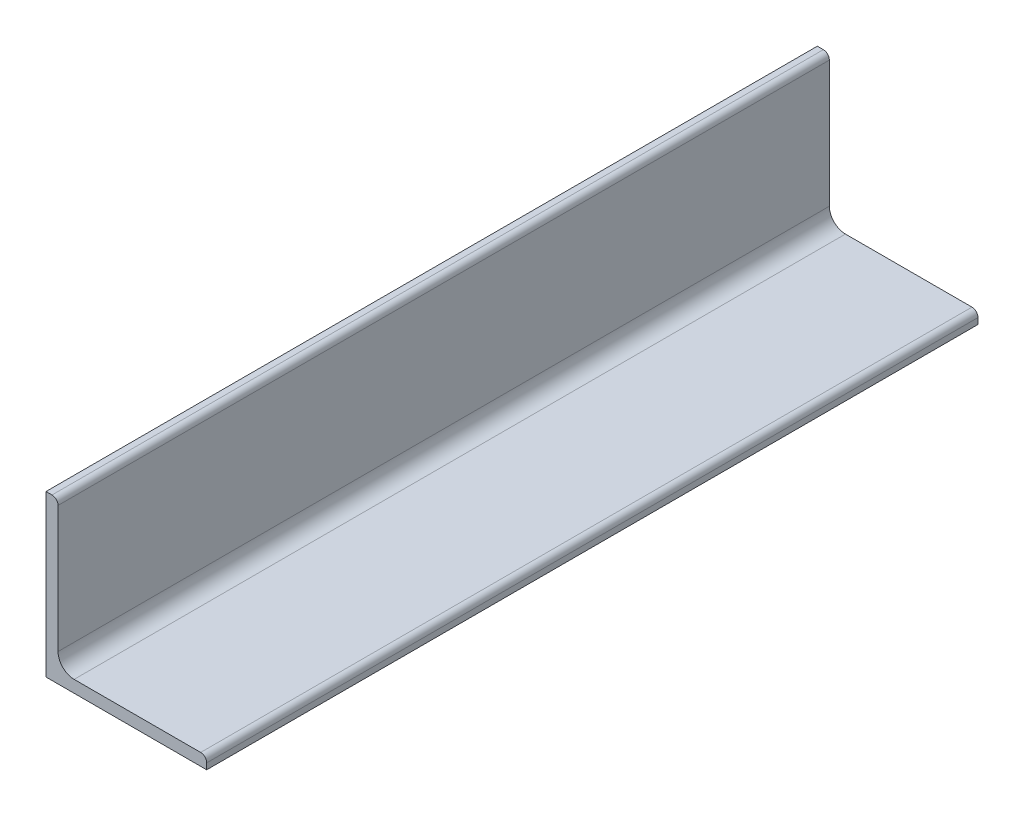
ISO-10303-21;
HEADER;
FILE_DESCRIPTION(('STEP AP214'),'2;1');
FILE_NAME('part.step','',(''),(''),'','','');
FILE_SCHEMA(('AUTOMOTIVE_DESIGN { 1 0 10303 214 1 1 1 1 }'));
ENDSEC;
DATA;
#1=APPLICATION_CONTEXT('core data for automotive mechanical design processes');
#2=APPLICATION_PROTOCOL_DEFINITION('international standard','automotive_design',2000,#1);
#3=PRODUCT_CONTEXT('',#1,'mechanical');
#4=PRODUCT('Part','Part','',(#3));
#5=PRODUCT_RELATED_PRODUCT_CATEGORY('part','',(#4));
#6=PRODUCT_DEFINITION_FORMATION('','',#4);
#7=PRODUCT_DEFINITION_CONTEXT('part definition',#1,'design');
#8=PRODUCT_DEFINITION('design','',#6,#7);
#9=PRODUCT_DEFINITION_SHAPE('','',#8);
#10=(LENGTH_UNIT() NAMED_UNIT(*) SI_UNIT(.MILLI.,.METRE.));
#11=(NAMED_UNIT(*) PLANE_ANGLE_UNIT() SI_UNIT($,.RADIAN.));
#12=(NAMED_UNIT(*) SI_UNIT($,.STERADIAN.) SOLID_ANGLE_UNIT());
#13=UNCERTAINTY_MEASURE_WITH_UNIT(LENGTH_MEASURE(1.E-05),#10,'distance_accuracy_value','');
#14=(GEOMETRIC_REPRESENTATION_CONTEXT(3) GLOBAL_UNCERTAINTY_ASSIGNED_CONTEXT((#13)) GLOBAL_UNIT_ASSIGNED_CONTEXT((#10,
#11,#12)) REPRESENTATION_CONTEXT('',''));
#15=CARTESIAN_POINT('',(0.,0.,0.));
#16=DIRECTION('',(0.,0.,1.));
#17=DIRECTION('',(1.,0.,0.));
#18=AXIS2_PLACEMENT_3D('',#15,#16,#17);
#19=CARTESIAN_POINT('',(0.897927251325018,63.8534276781816,304.8));
#20=DIRECTION('',(1.,0.,0.));
#21=DIRECTION('',(0.,0.,-1.));
#22=AXIS2_PLACEMENT_3D('',#19,#20,#21);
#23=PLANE('',#22);
#24=DIRECTION('',(0.,-1.,0.));
#25=VECTOR('',#24,1.);
#26=CARTESIAN_POINT('',(0.897927251325018,63.8534276781816,0.));
#27=LINE('',#26,#25);
#28=CARTESIAN_POINT('',(0.897927251325018,63.8534276781816,0.));
#29=VERTEX_POINT('',#28);
#30=CARTESIAN_POINT('',(0.897927251325018,0.353427678181561,0.));
#31=VERTEX_POINT('',#30);
#32=EDGE_CURVE('E135',#29,#31,#27,.T.);
#33=ORIENTED_EDGE('',*,*,#32,.T.);
#34=DIRECTION('',(0.,0.,-1.));
#35=VECTOR('',#34,1.);
#36=CARTESIAN_POINT('',(0.897927251325018,0.353427678181561,304.8));
#37=LINE('',#36,#35);
#38=CARTESIAN_POINT('',(0.897927251325018,0.353427678181561,304.8));
#39=VERTEX_POINT('',#38);
#40=EDGE_CURVE('E11',#39,#31,#37,.T.);
#41=ORIENTED_EDGE('',*,*,#40,.F.);
#42=DIRECTION('',(0.,-1.,0.));
#43=VECTOR('',#42,1.);
#44=CARTESIAN_POINT('',(0.897927251325018,63.8534276781816,304.8));
#45=LINE('',#44,#43);
#46=CARTESIAN_POINT('',(0.897927251325018,63.8534276781816,304.8));
#47=VERTEX_POINT('',#46);
#48=EDGE_CURVE('E151',#47,#39,#45,.T.);
#49=ORIENTED_EDGE('',*,*,#48,.F.);
#50=DIRECTION('',(0.,0.,-1.));
#51=VECTOR('',#50,1.);
#52=CARTESIAN_POINT('',(0.897927251325018,63.8534276781816,304.8));
#53=LINE('',#52,#51);
#54=EDGE_CURVE('E131',#47,#29,#53,.T.);
#55=ORIENTED_EDGE('',*,*,#54,.T.);
#56=EDGE_LOOP('',(#33,#41,#49,#55));
#57=FACE_BOUND('',#56,.T.);
#58=ADVANCED_FACE('F33',(#57),#23,.F.);
#59=CARTESIAN_POINT('',(0.897927251325018,0.353427678181561,304.8));
#60=DIRECTION('',(0.,1.,0.));
#61=DIRECTION('',(0.,0.,1.));
#62=AXIS2_PLACEMENT_3D('',#59,#60,#61);
#63=PLANE('',#62);
#64=DIRECTION('',(1.,0.,0.));
#65=VECTOR('',#64,1.);
#66=CARTESIAN_POINT('',(0.897927251325018,0.353427678181561,0.));
#67=LINE('',#66,#65);
#68=CARTESIAN_POINT('',(64.397927251325,0.353427678181561,0.));
#69=VERTEX_POINT('',#68);
#70=EDGE_CURVE('E138',#31,#69,#67,.T.);
#71=ORIENTED_EDGE('',*,*,#70,.T.);
#72=DIRECTION('',(0.,0.,-1.));
#73=VECTOR('',#72,1.);
#74=CARTESIAN_POINT('',(64.397927251325,0.353427678181561,304.8));
#75=LINE('',#74,#73);
#76=CARTESIAN_POINT('',(64.397927251325,0.353427678181561,304.8));
#77=VERTEX_POINT('',#76);
#78=EDGE_CURVE('E41',#77,#69,#75,.T.);
#79=ORIENTED_EDGE('',*,*,#78,.F.);
#80=DIRECTION('',(1.,0.,0.));
#81=VECTOR('',#80,1.);
#82=CARTESIAN_POINT('',(0.897927251325018,0.353427678181561,304.8));
#83=LINE('',#82,#81);
#84=EDGE_CURVE('E95',#39,#77,#83,.T.);
#85=ORIENTED_EDGE('',*,*,#84,.F.);
#86=ORIENTED_EDGE('',*,*,#40,.T.);
#87=EDGE_LOOP('',(#71,#79,#85,#86));
#88=FACE_BOUND('',#87,.T.);
#89=ADVANCED_FACE('F194',(#88),#63,.F.);
#90=CARTESIAN_POINT('',(64.397927251325,0.353427678181561,304.8));
#91=DIRECTION('',(-1.,0.,0.));
#92=DIRECTION('',(0.,0.,1.));
#93=AXIS2_PLACEMENT_3D('',#90,#91,#92);
#94=PLANE('',#93);
#95=DIRECTION('',(0.,1.,0.));
#96=VECTOR('',#95,1.);
#97=CARTESIAN_POINT('',(64.397927251325,0.353427678181561,0.));
#98=LINE('',#97,#96);
#99=CARTESIAN_POINT('',(64.397927251325,2.73467767818156,0.));
#100=VERTEX_POINT('',#99);
#101=EDGE_CURVE('E140',#69,#100,#98,.T.);
#102=ORIENTED_EDGE('',*,*,#101,.T.);
#103=DIRECTION('',(0.,0.,-1.));
#104=VECTOR('',#103,1.);
#105=CARTESIAN_POINT('',(64.397927251325,2.73467767818156,304.8));
#106=LINE('',#105,#104);
#107=CARTESIAN_POINT('',(64.397927251325,2.73467767818156,304.8));
#108=VERTEX_POINT('',#107);
#109=EDGE_CURVE('E161',#108,#100,#106,.T.);
#110=ORIENTED_EDGE('',*,*,#109,.F.);
#111=DIRECTION('',(0.,1.,0.));
#112=VECTOR('',#111,1.);
#113=CARTESIAN_POINT('',(64.397927251325,0.353427678181561,304.8));
#114=LINE('',#113,#112);
#115=EDGE_CURVE('E169',#77,#108,#114,.T.);
#116=ORIENTED_EDGE('',*,*,#115,.F.);
#117=ORIENTED_EDGE('',*,*,#78,.T.);
#118=EDGE_LOOP('',(#102,#110,#116,#117));
#119=FACE_BOUND('',#118,.T.);
#120=ADVANCED_FACE('F167',(#119),#94,.F.);
#121=CARTESIAN_POINT('',(62.016677251325,2.73467767818156,304.8));
#122=DIRECTION('',(0.,0.,-1.));
#123=DIRECTION('',(-1.,0.,0.));
#124=AXIS2_PLACEMENT_3D('',#121,#122,#123);
#125=CYLINDRICAL_SURFACE('',#124,2.38125);
#126=CARTESIAN_POINT('',(62.016677251325,2.73467767818156,0.));
#127=DIRECTION('',(0.,0.,1.));
#128=DIRECTION('',(1.,0.,0.));
#129=AXIS2_PLACEMENT_3D('',#126,#127,#128);
#130=CIRCLE('',#129,2.38125);
#131=CARTESIAN_POINT('',(62.016677251325,5.11592767818156,0.));
#132=VERTEX_POINT('',#131);
#133=EDGE_CURVE('E142',#100,#132,#130,.T.);
#134=ORIENTED_EDGE('',*,*,#133,.T.);
#135=DIRECTION('',(0.,0.,-1.));
#136=VECTOR('',#135,1.);
#137=CARTESIAN_POINT('',(62.016677251325,5.11592767818156,304.8));
#138=LINE('',#137,#136);
#139=CARTESIAN_POINT('',(62.016677251325,5.11592767818156,304.8));
#140=VERTEX_POINT('',#139);
#141=EDGE_CURVE('E158',#140,#132,#138,.T.);
#142=ORIENTED_EDGE('',*,*,#141,.F.);
#143=CARTESIAN_POINT('',(62.016677251325,2.73467767818156,304.8));
#144=DIRECTION('',(0.,0.,1.));
#145=DIRECTION('',(1.,0.,0.));
#146=AXIS2_PLACEMENT_3D('',#143,#144,#145);
#147=CIRCLE('',#146,2.38125);
#148=EDGE_CURVE('E185',#108,#140,#147,.T.);
#149=ORIENTED_EDGE('',*,*,#148,.F.);
#150=ORIENTED_EDGE('',*,*,#109,.T.);
#151=EDGE_LOOP('',(#134,#142,#149,#150));
#152=FACE_BOUND('',#151,.T.);
#153=ADVANCED_FACE('F178',(#152),#125,.T.);
#154=CARTESIAN_POINT('',(62.016677251325,5.11592767818156,304.8));
#155=DIRECTION('',(0.,-1.,0.));
#156=DIRECTION('',(0.,0.,-1.));
#157=AXIS2_PLACEMENT_3D('',#154,#155,#156);
#158=PLANE('',#157);
#159=DIRECTION('',(-1.,0.,0.));
#160=VECTOR('',#159,1.);
#161=CARTESIAN_POINT('',(62.016677251325,5.11592767818156,0.));
#162=LINE('',#161,#160);
#163=CARTESIAN_POINT('',(12.010427251325,5.11592767818156,0.));
#164=VERTEX_POINT('',#163);
#165=EDGE_CURVE('E144',#132,#164,#162,.T.);
#166=ORIENTED_EDGE('',*,*,#165,.T.);
#167=DIRECTION('',(0.,0.,-1.));
#168=VECTOR('',#167,1.);
#169=CARTESIAN_POINT('',(12.010427251325,5.11592767818156,304.8));
#170=LINE('',#169,#168);
#171=CARTESIAN_POINT('',(12.010427251325,5.11592767818156,304.8));
#172=VERTEX_POINT('',#171);
#173=EDGE_CURVE('E155',#172,#164,#170,.T.);
#174=ORIENTED_EDGE('',*,*,#173,.F.);
#175=DIRECTION('',(-1.,0.,0.));
#176=VECTOR('',#175,1.);
#177=CARTESIAN_POINT('',(62.016677251325,5.11592767818156,304.8));
#178=LINE('',#177,#176);
#179=EDGE_CURVE('E184',#140,#172,#178,.T.);
#180=ORIENTED_EDGE('',*,*,#179,.F.);
#181=ORIENTED_EDGE('',*,*,#141,.T.);
#182=EDGE_LOOP('',(#166,#174,#180,#181));
#183=FACE_BOUND('',#182,.T.);
#184=ADVANCED_FACE('F182',(#183),#158,.F.);
#185=CARTESIAN_POINT('',(12.010427251325,11.4659276781816,304.8));
#186=DIRECTION('',(0.,0.,-1.));
#187=DIRECTION('',(-1.,0.,0.));
#188=AXIS2_PLACEMENT_3D('',#185,#186,#187);
#189=CYLINDRICAL_SURFACE('',#188,6.34999999999999);
#190=CARTESIAN_POINT('',(12.010427251325,11.4659276781816,0.));
#191=DIRECTION('',(0.,0.,-1.));
#192=DIRECTION('',(1.,0.,0.));
#193=AXIS2_PLACEMENT_3D('',#190,#191,#192);
#194=CIRCLE('',#193,6.34999999999999);
#195=CARTESIAN_POINT('',(5.66042725132502,11.4659276781816,0.));
#196=VERTEX_POINT('',#195);
#197=EDGE_CURVE('E146',#164,#196,#194,.T.);
#198=ORIENTED_EDGE('',*,*,#197,.T.);
#199=DIRECTION('',(0.,0.,-1.));
#200=VECTOR('',#199,1.);
#201=CARTESIAN_POINT('',(5.66042725132502,11.4659276781816,304.8));
#202=LINE('',#201,#200);
#203=CARTESIAN_POINT('',(5.66042725132502,11.4659276781816,304.8));
#204=VERTEX_POINT('',#203);
#205=EDGE_CURVE('E126',#204,#196,#202,.T.);
#206=ORIENTED_EDGE('',*,*,#205,.F.);
#207=CARTESIAN_POINT('',(12.010427251325,11.4659276781816,304.8));
#208=DIRECTION('',(0.,0.,-1.));
#209=DIRECTION('',(1.,0.,0.));
#210=AXIS2_PLACEMENT_3D('',#207,#208,#209);
#211=CIRCLE('',#210,6.34999999999999);
#212=EDGE_CURVE('E117',#172,#204,#211,.T.);
#213=ORIENTED_EDGE('',*,*,#212,.F.);
#214=ORIENTED_EDGE('',*,*,#173,.T.);
#215=EDGE_LOOP('',(#198,#206,#213,#214));
#216=FACE_BOUND('',#215,.T.);
#217=ADVANCED_FACE('F206',(#216),#189,.F.);
#218=CARTESIAN_POINT('',(5.66042725132502,11.4659276781816,304.8));
#219=DIRECTION('',(-1.,0.,0.));
#220=DIRECTION('',(0.,0.,1.));
#221=AXIS2_PLACEMENT_3D('',#218,#219,#220);
#222=PLANE('',#221);
#223=DIRECTION('',(0.,1.,0.));
#224=VECTOR('',#223,1.);
#225=CARTESIAN_POINT('',(5.66042725132502,11.4659276781816,0.));
#226=LINE('',#225,#224);
#227=CARTESIAN_POINT('',(5.66042725132502,61.4721776781816,0.));
#228=VERTEX_POINT('',#227);
#229=EDGE_CURVE('E125',#196,#228,#226,.T.);
#230=ORIENTED_EDGE('',*,*,#229,.T.);
#231=DIRECTION('',(0.,0.,-1.));
#232=VECTOR('',#231,1.);
#233=CARTESIAN_POINT('',(5.66042725132502,61.4721776781816,304.8));
#234=LINE('',#233,#232);
#235=CARTESIAN_POINT('',(5.66042725132502,61.4721776781816,304.8));
#236=VERTEX_POINT('',#235);
#237=EDGE_CURVE('E122',#236,#228,#234,.T.);
#238=ORIENTED_EDGE('',*,*,#237,.F.);
#239=DIRECTION('',(0.,1.,0.));
#240=VECTOR('',#239,1.);
#241=CARTESIAN_POINT('',(5.66042725132502,11.4659276781816,304.8));
#242=LINE('',#241,#240);
#243=EDGE_CURVE('E111',#204,#236,#242,.T.);
#244=ORIENTED_EDGE('',*,*,#243,.F.);
#245=ORIENTED_EDGE('',*,*,#205,.T.);
#246=EDGE_LOOP('',(#230,#238,#244,#245));
#247=FACE_BOUND('',#246,.T.);
#248=ADVANCED_FACE('F123',(#247),#222,.F.);
#249=CARTESIAN_POINT('',(3.27917725132502,61.4721776781816,304.8));
#250=DIRECTION('',(0.,0.,-1.));
#251=DIRECTION('',(-1.,0.,0.));
#252=AXIS2_PLACEMENT_3D('',#249,#250,#251);
#253=CYLINDRICAL_SURFACE('',#252,2.38125);
#254=CARTESIAN_POINT('',(3.27917725132502,61.4721776781816,0.));
#255=DIRECTION('',(0.,0.,1.));
#256=DIRECTION('',(1.,0.,0.));
#257=AXIS2_PLACEMENT_3D('',#254,#255,#256);
#258=CIRCLE('',#257,2.38125);
#259=CARTESIAN_POINT('',(3.27917725132502,63.8534276781816,0.));
#260=VERTEX_POINT('',#259);
#261=EDGE_CURVE('E81',#228,#260,#258,.T.);
#262=ORIENTED_EDGE('',*,*,#261,.T.);
#263=DIRECTION('',(0.,0.,-1.));
#264=VECTOR('',#263,1.);
#265=CARTESIAN_POINT('',(3.27917725132502,63.8534276781816,304.8));
#266=LINE('',#265,#264);
#267=CARTESIAN_POINT('',(3.27917725132502,63.8534276781816,304.8));
#268=VERTEX_POINT('',#267);
#269=EDGE_CURVE('E127',#268,#260,#266,.T.);
#270=ORIENTED_EDGE('',*,*,#269,.F.);
#271=CARTESIAN_POINT('',(3.27917725132502,61.4721776781816,304.8));
#272=DIRECTION('',(0.,0.,1.));
#273=DIRECTION('',(1.,0.,0.));
#274=AXIS2_PLACEMENT_3D('',#271,#272,#273);
#275=CIRCLE('',#274,2.38125);
#276=EDGE_CURVE('E115',#236,#268,#275,.T.);
#277=ORIENTED_EDGE('',*,*,#276,.F.);
#278=ORIENTED_EDGE('',*,*,#237,.T.);
#279=EDGE_LOOP('',(#262,#270,#277,#278));
#280=FACE_BOUND('',#279,.T.);
#281=ADVANCED_FACE('F129',(#280),#253,.T.);
#282=CARTESIAN_POINT('',(3.27917725132502,63.8534276781816,304.8));
#283=DIRECTION('',(0.,-1.,0.));
#284=DIRECTION('',(0.,0.,-1.));
#285=AXIS2_PLACEMENT_3D('',#282,#283,#284);
#286=PLANE('',#285);
#287=DIRECTION('',(-1.,0.,0.));
#288=VECTOR('',#287,1.);
#289=CARTESIAN_POINT('',(3.27917725132502,63.8534276781816,0.));
#290=LINE('',#289,#288);
#291=EDGE_CURVE('E87',#260,#29,#290,.T.);
#292=ORIENTED_EDGE('',*,*,#291,.T.);
#293=ORIENTED_EDGE('',*,*,#54,.F.);
#294=DIRECTION('',(-1.,0.,0.));
#295=VECTOR('',#294,1.);
#296=CARTESIAN_POINT('',(3.27917725132502,63.8534276781816,304.8));
#297=LINE('',#296,#295);
#298=EDGE_CURVE('E49',#268,#47,#297,.T.);
#299=ORIENTED_EDGE('',*,*,#298,.F.);
#300=ORIENTED_EDGE('',*,*,#269,.T.);
#301=EDGE_LOOP('',(#292,#293,#299,#300));
#302=FACE_BOUND('',#301,.T.);
#303=ADVANCED_FACE('F214',(#302),#286,.F.);
#304=CARTESIAN_POINT('',(62.016677251325,2.73467767818156,304.8));
#305=DIRECTION('',(0.,0.,1.));
#306=DIRECTION('',(1.,0.,0.));
#307=AXIS2_PLACEMENT_3D('',#304,#305,#306);
#308=PLANE('',#307);
#309=ORIENTED_EDGE('',*,*,#48,.T.);
#310=ORIENTED_EDGE('',*,*,#84,.T.);
#311=ORIENTED_EDGE('',*,*,#115,.T.);
#312=ORIENTED_EDGE('',*,*,#148,.T.);
#313=ORIENTED_EDGE('',*,*,#179,.T.);
#314=ORIENTED_EDGE('',*,*,#212,.T.);
#315=ORIENTED_EDGE('',*,*,#243,.T.);
#316=ORIENTED_EDGE('',*,*,#276,.T.);
#317=ORIENTED_EDGE('',*,*,#298,.T.);
#318=EDGE_LOOP('',(#309,#310,#311,#312,#313,#314,#315,#316,#317));
#319=FACE_BOUND('',#318,.T.);
#320=ADVANCED_FACE('F113',(#319),#308,.T.);
#321=CARTESIAN_POINT('',(62.016677251325,2.73467767818156,0.));
#322=DIRECTION('',(0.,0.,1.));
#323=DIRECTION('',(1.,0.,0.));
#324=AXIS2_PLACEMENT_3D('',#321,#322,#323);
#325=PLANE('',#324);
#326=ORIENTED_EDGE('',*,*,#32,.F.);
#327=ORIENTED_EDGE('',*,*,#291,.F.);
#328=ORIENTED_EDGE('',*,*,#261,.F.);
#329=ORIENTED_EDGE('',*,*,#229,.F.);
#330=ORIENTED_EDGE('',*,*,#197,.F.);
#331=ORIENTED_EDGE('',*,*,#165,.F.);
#332=ORIENTED_EDGE('',*,*,#133,.F.);
#333=ORIENTED_EDGE('',*,*,#101,.F.);
#334=ORIENTED_EDGE('',*,*,#70,.F.);
#335=EDGE_LOOP('',(#326,#327,#328,#329,#330,#331,#332,#333,#334));
#336=FACE_BOUND('',#335,.T.);
#337=ADVANCED_FACE('F173',(#336),#325,.F.);
#338=CLOSED_SHELL('',(#58,#89,#120,#153,#184,#217,#248,#281,#303,#320,#337));
#339=MANIFOLD_SOLID_BREP('B2',#338);
#340=ADVANCED_BREP_SHAPE_REPRESENTATION('',(#18,#339),#14);
#341=SHAPE_DEFINITION_REPRESENTATION(#9,#340);
ENDSEC;
END-ISO-10303-21;
